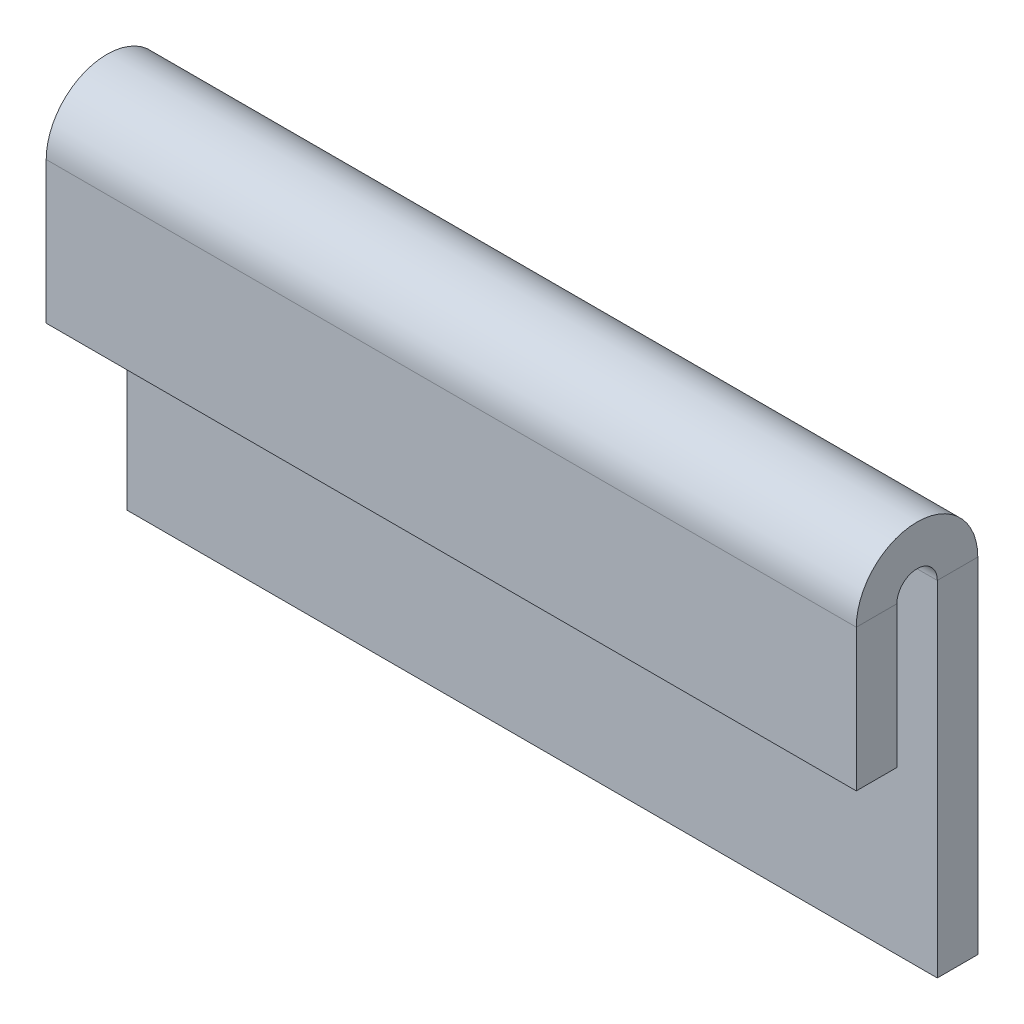
ISO-10303-21;
HEADER;
FILE_DESCRIPTION(('STEP AP214'),'2;1');
FILE_NAME('part.step','',(''),(''),'','','');
FILE_SCHEMA(('AUTOMOTIVE_DESIGN { 1 0 10303 214 1 1 1 1 }'));
ENDSEC;
DATA;
#1=APPLICATION_CONTEXT('core data for automotive mechanical design processes');
#2=APPLICATION_PROTOCOL_DEFINITION('international standard','automotive_design',2000,#1);
#3=PRODUCT_CONTEXT('',#1,'mechanical');
#4=PRODUCT('Part','Part','',(#3));
#5=PRODUCT_RELATED_PRODUCT_CATEGORY('part','',(#4));
#6=PRODUCT_DEFINITION_FORMATION('','',#4);
#7=PRODUCT_DEFINITION_CONTEXT('part definition',#1,'design');
#8=PRODUCT_DEFINITION('design','',#6,#7);
#9=PRODUCT_DEFINITION_SHAPE('','',#8);
#10=(LENGTH_UNIT() NAMED_UNIT(*) SI_UNIT(.MILLI.,.METRE.));
#11=(NAMED_UNIT(*) PLANE_ANGLE_UNIT() SI_UNIT($,.RADIAN.));
#12=(NAMED_UNIT(*) SI_UNIT($,.STERADIAN.) SOLID_ANGLE_UNIT());
#13=UNCERTAINTY_MEASURE_WITH_UNIT(LENGTH_MEASURE(1.E-05),#10,'distance_accuracy_value','');
#14=(GEOMETRIC_REPRESENTATION_CONTEXT(3) GLOBAL_UNCERTAINTY_ASSIGNED_CONTEXT((#13)) GLOBAL_UNIT_ASSIGNED_CONTEXT((#10,
#11,#12)) REPRESENTATION_CONTEXT('',''));
#15=CARTESIAN_POINT('',(0.,0.,0.));
#16=DIRECTION('',(0.,0.,1.));
#17=DIRECTION('',(1.,0.,0.));
#18=AXIS2_PLACEMENT_3D('',#15,#16,#17);
#19=CARTESIAN_POINT('',(0.,0.,-1.));
#20=DIRECTION('',(-1.,0.,0.));
#21=DIRECTION('',(0.,0.,1.));
#22=AXIS2_PLACEMENT_3D('',#19,#20,#21);
#23=PLANE('',#22);
#24=DIRECTION('',(0.,-1.,0.));
#25=VECTOR('',#24,1.);
#26=CARTESIAN_POINT('',(0.,0.,0.));
#27=LINE('',#26,#25);
#28=CARTESIAN_POINT('',(0.,8.5,0.));
#29=VERTEX_POINT('',#28);
#30=CARTESIAN_POINT('',(0.,0.,0.));
#31=VERTEX_POINT('',#30);
#32=EDGE_CURVE('E100',#29,#31,#27,.T.);
#33=ORIENTED_EDGE('',*,*,#32,.F.);
#34=DIRECTION('',(0.,0.,-1.));
#35=VECTOR('',#34,1.);
#36=CARTESIAN_POINT('',(0.,8.5,0.));
#37=LINE('',#36,#35);
#38=CARTESIAN_POINT('',(0.,8.5,-1.));
#39=VERTEX_POINT('',#38);
#40=EDGE_CURVE('E142',#29,#39,#37,.T.);
#41=ORIENTED_EDGE('',*,*,#40,.T.);
#42=DIRECTION('',(0.,-1.,0.));
#43=VECTOR('',#42,1.);
#44=CARTESIAN_POINT('',(0.,0.,-1.));
#45=LINE('',#44,#43);
#46=CARTESIAN_POINT('',(0.,0.,-1.));
#47=VERTEX_POINT('',#46);
#48=EDGE_CURVE('E91',#39,#47,#45,.T.);
#49=ORIENTED_EDGE('',*,*,#48,.T.);
#50=DIRECTION('',(0.,0.,1.));
#51=VECTOR('',#50,1.);
#52=CARTESIAN_POINT('',(0.,0.,-1.));
#53=LINE('',#52,#51);
#54=EDGE_CURVE('E50',#47,#31,#53,.T.);
#55=ORIENTED_EDGE('',*,*,#54,.T.);
#56=EDGE_LOOP('',(#33,#41,#49,#55));
#57=FACE_BOUND('',#56,.T.);
#58=ADVANCED_FACE('F42',(#57),#23,.T.);
#59=CARTESIAN_POINT('',(20.,0.,-1.));
#60=DIRECTION('',(1.,0.,0.));
#61=DIRECTION('',(0.,0.,-1.));
#62=AXIS2_PLACEMENT_3D('',#59,#60,#61);
#63=PLANE('',#62);
#64=DIRECTION('',(0.,0.,-1.));
#65=VECTOR('',#64,1.);
#66=CARTESIAN_POINT('',(20.,8.5,0.));
#67=LINE('',#66,#65);
#68=CARTESIAN_POINT('',(20.,8.5,0.));
#69=VERTEX_POINT('',#68);
#70=CARTESIAN_POINT('',(20.,8.5,-1.));
#71=VERTEX_POINT('',#70);
#72=EDGE_CURVE('E89',#69,#71,#67,.T.);
#73=ORIENTED_EDGE('',*,*,#72,.F.);
#74=DIRECTION('',(0.,1.,0.));
#75=VECTOR('',#74,1.);
#76=CARTESIAN_POINT('',(20.,0.,0.));
#77=LINE('',#76,#75);
#78=CARTESIAN_POINT('',(20.,0.,0.));
#79=VERTEX_POINT('',#78);
#80=EDGE_CURVE('E88',#79,#69,#77,.T.);
#81=ORIENTED_EDGE('',*,*,#80,.F.);
#82=DIRECTION('',(0.,0.,1.));
#83=VECTOR('',#82,1.);
#84=CARTESIAN_POINT('',(20.,0.,-1.));
#85=LINE('',#84,#83);
#86=CARTESIAN_POINT('',(20.,0.,-1.));
#87=VERTEX_POINT('',#86);
#88=EDGE_CURVE('E11',#87,#79,#85,.T.);
#89=ORIENTED_EDGE('',*,*,#88,.F.);
#90=DIRECTION('',(0.,1.,0.));
#91=VECTOR('',#90,1.);
#92=CARTESIAN_POINT('',(20.,0.,-1.));
#93=LINE('',#92,#91);
#94=EDGE_CURVE('E103',#87,#71,#93,.T.);
#95=ORIENTED_EDGE('',*,*,#94,.T.);
#96=EDGE_LOOP('',(#73,#81,#89,#95));
#97=FACE_BOUND('',#96,.T.);
#98=ADVANCED_FACE('F87',(#97),#63,.T.);
#99=CARTESIAN_POINT('',(0.,0.,-1.));
#100=DIRECTION('',(0.,-1.,0.));
#101=DIRECTION('',(0.,0.,-1.));
#102=AXIS2_PLACEMENT_3D('',#99,#100,#101);
#103=PLANE('',#102);
#104=DIRECTION('',(1.,0.,0.));
#105=VECTOR('',#104,1.);
#106=CARTESIAN_POINT('',(0.,0.,0.));
#107=LINE('',#106,#105);
#108=EDGE_CURVE('E81',#31,#79,#107,.T.);
#109=ORIENTED_EDGE('',*,*,#108,.F.);
#110=ORIENTED_EDGE('',*,*,#54,.F.);
#111=DIRECTION('',(1.,0.,0.));
#112=VECTOR('',#111,1.);
#113=CARTESIAN_POINT('',(0.,0.,-1.));
#114=LINE('',#113,#112);
#115=EDGE_CURVE('E84',#47,#87,#114,.T.);
#116=ORIENTED_EDGE('',*,*,#115,.T.);
#117=ORIENTED_EDGE('',*,*,#88,.T.);
#118=EDGE_LOOP('',(#109,#110,#116,#117));
#119=FACE_BOUND('',#118,.T.);
#120=ADVANCED_FACE('F77',(#119),#103,.T.);
#121=CARTESIAN_POINT('',(0.,0.,-1.));
#122=DIRECTION('',(0.,0.,-1.));
#123=DIRECTION('',(-1.,0.,0.));
#124=AXIS2_PLACEMENT_3D('',#121,#122,#123);
#125=PLANE('',#124);
#126=DIRECTION('',(-1.,0.,0.));
#127=VECTOR('',#126,1.);
#128=CARTESIAN_POINT('',(0.,8.5,-1.));
#129=LINE('',#128,#127);
#130=EDGE_CURVE('E156',#39,#71,#129,.F.);
#131=ORIENTED_EDGE('',*,*,#130,.T.);
#132=ORIENTED_EDGE('',*,*,#94,.F.);
#133=ORIENTED_EDGE('',*,*,#115,.F.);
#134=ORIENTED_EDGE('',*,*,#48,.F.);
#135=EDGE_LOOP('',(#131,#132,#133,#134));
#136=FACE_BOUND('',#135,.T.);
#137=ADVANCED_FACE('F163',(#136),#125,.T.);
#138=CARTESIAN_POINT('',(0.,0.,0.));
#139=DIRECTION('',(0.,0.,-1.));
#140=DIRECTION('',(-1.,0.,0.));
#141=AXIS2_PLACEMENT_3D('',#138,#139,#140);
#142=PLANE('',#141);
#143=ORIENTED_EDGE('',*,*,#80,.T.);
#144=DIRECTION('',(-1.,0.,0.));
#145=VECTOR('',#144,1.);
#146=CARTESIAN_POINT('',(0.,8.5,0.));
#147=LINE('',#146,#145);
#148=EDGE_CURVE('E146',#29,#69,#147,.F.);
#149=ORIENTED_EDGE('',*,*,#148,.F.);
#150=ORIENTED_EDGE('',*,*,#32,.T.);
#151=ORIENTED_EDGE('',*,*,#108,.T.);
#152=EDGE_LOOP('',(#143,#149,#150,#151));
#153=FACE_BOUND('',#152,.T.);
#154=ADVANCED_FACE('F92',(#153),#142,.F.);
#155=CARTESIAN_POINT('',(0.,6.75,2.));
#156=DIRECTION('',(1.,0.,0.));
#157=DIRECTION('',(0.,1.,0.));
#158=AXIS2_PLACEMENT_3D('',#155,#156,#157);
#159=PLANE('',#158);
#160=DIRECTION('',(0.,0.,1.));
#161=VECTOR('',#160,1.);
#162=CARTESIAN_POINT('',(0.,8.5,2.));
#163=LINE('',#162,#161);
#164=CARTESIAN_POINT('',(0.,8.5,1.));
#165=VERTEX_POINT('',#164);
#166=CARTESIAN_POINT('',(0.,8.5,2.));
#167=VERTEX_POINT('',#166);
#168=EDGE_CURVE('E111',#165,#167,#163,.T.);
#169=ORIENTED_EDGE('',*,*,#168,.F.);
#170=DIRECTION('',(0.,1.,0.));
#171=VECTOR('',#170,1.);
#172=CARTESIAN_POINT('',(0.,6.75,1.));
#173=LINE('',#172,#171);
#174=CARTESIAN_POINT('',(0.,5.,1.));
#175=VERTEX_POINT('',#174);
#176=EDGE_CURVE('E122',#175,#165,#173,.T.);
#177=ORIENTED_EDGE('',*,*,#176,.F.);
#178=DIRECTION('',(0.,0.,1.));
#179=VECTOR('',#178,1.);
#180=CARTESIAN_POINT('',(0.,5.,2.));
#181=LINE('',#180,#179);
#182=CARTESIAN_POINT('',(0.,5.,2.));
#183=VERTEX_POINT('',#182);
#184=EDGE_CURVE('E109',#175,#183,#181,.T.);
#185=ORIENTED_EDGE('',*,*,#184,.T.);
#186=DIRECTION('',(0.,1.,0.));
#187=VECTOR('',#186,1.);
#188=CARTESIAN_POINT('',(0.,6.75,2.));
#189=LINE('',#188,#187);
#190=EDGE_CURVE('E137',#183,#167,#189,.T.);
#191=ORIENTED_EDGE('',*,*,#190,.T.);
#192=EDGE_LOOP('',(#169,#177,#185,#191));
#193=FACE_BOUND('',#192,.T.);
#194=ADVANCED_FACE('F186',(#193),#159,.F.);
#195=CARTESIAN_POINT('',(10.,5.,2.));
#196=DIRECTION('',(0.,1.,0.));
#197=DIRECTION('',(-1.,0.,0.));
#198=AXIS2_PLACEMENT_3D('',#195,#196,#197);
#199=PLANE('',#198);
#200=ORIENTED_EDGE('',*,*,#184,.F.);
#201=DIRECTION('',(1.,0.,0.));
#202=VECTOR('',#201,1.);
#203=CARTESIAN_POINT('',(10.,5.,1.));
#204=LINE('',#203,#202);
#205=CARTESIAN_POINT('',(20.,5.,1.));
#206=VERTEX_POINT('',#205);
#207=EDGE_CURVE('E126',#206,#175,#204,.F.);
#208=ORIENTED_EDGE('',*,*,#207,.F.);
#209=DIRECTION('',(0.,0.,1.));
#210=VECTOR('',#209,1.);
#211=CARTESIAN_POINT('',(20.,5.,2.));
#212=LINE('',#211,#210);
#213=CARTESIAN_POINT('',(20.,5.,2.));
#214=VERTEX_POINT('',#213);
#215=EDGE_CURVE('E110',#206,#214,#212,.T.);
#216=ORIENTED_EDGE('',*,*,#215,.T.);
#217=DIRECTION('',(-1.,0.,0.));
#218=VECTOR('',#217,1.);
#219=CARTESIAN_POINT('',(10.,5.,2.));
#220=LINE('',#219,#218);
#221=EDGE_CURVE('E112',#214,#183,#220,.T.);
#222=ORIENTED_EDGE('',*,*,#221,.T.);
#223=EDGE_LOOP('',(#200,#208,#216,#222));
#224=FACE_BOUND('',#223,.T.);
#225=ADVANCED_FACE('F198',(#224),#199,.F.);
#226=CARTESIAN_POINT('',(20.,6.75,2.));
#227=DIRECTION('',(-1.,0.,0.));
#228=DIRECTION('',(0.,-1.,0.));
#229=AXIS2_PLACEMENT_3D('',#226,#227,#228);
#230=PLANE('',#229);
#231=DIRECTION('',(0.,1.,0.));
#232=VECTOR('',#231,1.);
#233=CARTESIAN_POINT('',(20.,6.75,1.));
#234=LINE('',#233,#232);
#235=CARTESIAN_POINT('',(20.,8.5,1.));
#236=VERTEX_POINT('',#235);
#237=EDGE_CURVE('E120',#236,#206,#234,.F.);
#238=ORIENTED_EDGE('',*,*,#237,.F.);
#239=DIRECTION('',(0.,0.,1.));
#240=VECTOR('',#239,1.);
#241=CARTESIAN_POINT('',(20.,8.5,2.));
#242=LINE('',#241,#240);
#243=CARTESIAN_POINT('',(20.,8.5,2.));
#244=VERTEX_POINT('',#243);
#245=EDGE_CURVE('E99',#236,#244,#242,.T.);
#246=ORIENTED_EDGE('',*,*,#245,.T.);
#247=DIRECTION('',(0.,-1.,0.));
#248=VECTOR('',#247,1.);
#249=CARTESIAN_POINT('',(20.,6.75,2.));
#250=LINE('',#249,#248);
#251=EDGE_CURVE('E133',#244,#214,#250,.T.);
#252=ORIENTED_EDGE('',*,*,#251,.T.);
#253=ORIENTED_EDGE('',*,*,#215,.F.);
#254=EDGE_LOOP('',(#238,#246,#252,#253));
#255=FACE_BOUND('',#254,.T.);
#256=ADVANCED_FACE('F192',(#255),#230,.F.);
#257=CARTESIAN_POINT('',(10.,6.75,2.));
#258=DIRECTION('',(0.,0.,1.));
#259=DIRECTION('',(1.,0.,0.));
#260=AXIS2_PLACEMENT_3D('',#257,#258,#259);
#261=PLANE('',#260);
#262=ORIENTED_EDGE('',*,*,#221,.F.);
#263=ORIENTED_EDGE('',*,*,#251,.F.);
#264=DIRECTION('',(1.,0.,0.));
#265=VECTOR('',#264,1.);
#266=CARTESIAN_POINT('',(10.,8.5,2.));
#267=LINE('',#266,#265);
#268=EDGE_CURVE('E135',#167,#244,#267,.T.);
#269=ORIENTED_EDGE('',*,*,#268,.F.);
#270=ORIENTED_EDGE('',*,*,#190,.F.);
#271=EDGE_LOOP('',(#262,#263,#269,#270));
#272=FACE_BOUND('',#271,.T.);
#273=ADVANCED_FACE('F195',(#272),#261,.T.);
#274=CARTESIAN_POINT('',(10.,6.75,1.));
#275=DIRECTION('',(0.,0.,1.));
#276=DIRECTION('',(1.,0.,0.));
#277=AXIS2_PLACEMENT_3D('',#274,#275,#276);
#278=PLANE('',#277);
#279=ORIENTED_EDGE('',*,*,#207,.T.);
#280=ORIENTED_EDGE('',*,*,#176,.T.);
#281=DIRECTION('',(1.,0.,0.));
#282=VECTOR('',#281,1.);
#283=CARTESIAN_POINT('',(10.,8.5,1.));
#284=LINE('',#283,#282);
#285=EDGE_CURVE('E125',#165,#236,#284,.T.);
#286=ORIENTED_EDGE('',*,*,#285,.T.);
#287=ORIENTED_EDGE('',*,*,#237,.T.);
#288=EDGE_LOOP('',(#279,#280,#286,#287));
#289=FACE_BOUND('',#288,.T.);
#290=ADVANCED_FACE('F204',(#289),#278,.F.);
#291=CARTESIAN_POINT('',(20.,8.5,0.5));
#292=DIRECTION('',(1.,0.,0.));
#293=DIRECTION('',(0.,0.,-1.));
#294=AXIS2_PLACEMENT_3D('',#291,#292,#293);
#295=PLANE('',#294);
#296=ORIENTED_EDGE('',*,*,#245,.F.);
#297=CARTESIAN_POINT('',(20.,8.5,0.5));
#298=DIRECTION('',(-1.,0.,0.));
#299=DIRECTION('',(0.,0.,1.));
#300=AXIS2_PLACEMENT_3D('',#297,#298,#299);
#301=CIRCLE('',#300,0.5);
#302=EDGE_CURVE('E147',#69,#236,#301,.F.);
#303=ORIENTED_EDGE('',*,*,#302,.F.);
#304=ORIENTED_EDGE('',*,*,#72,.T.);
#305=CARTESIAN_POINT('',(20.,8.5,0.5));
#306=DIRECTION('',(-1.,0.,0.));
#307=DIRECTION('',(0.,0.,1.));
#308=AXIS2_PLACEMENT_3D('',#305,#306,#307);
#309=CIRCLE('',#308,1.5);
#310=EDGE_CURVE('E144',#71,#244,#309,.F.);
#311=ORIENTED_EDGE('',*,*,#310,.T.);
#312=EDGE_LOOP('',(#296,#303,#304,#311));
#313=FACE_BOUND('',#312,.T.);
#314=ADVANCED_FACE('F210',(#313),#295,.T.);
#315=CARTESIAN_POINT('',(0.,8.5,0.5));
#316=DIRECTION('',(1.,0.,0.));
#317=DIRECTION('',(0.,0.,-1.));
#318=AXIS2_PLACEMENT_3D('',#315,#316,#317);
#319=PLANE('',#318);
#320=CARTESIAN_POINT('',(0.,8.5,0.5));
#321=DIRECTION('',(-1.,0.,0.));
#322=DIRECTION('',(0.,0.,1.));
#323=AXIS2_PLACEMENT_3D('',#320,#321,#322);
#324=CIRCLE('',#323,0.5);
#325=EDGE_CURVE('E59',#165,#29,#324,.T.);
#326=ORIENTED_EDGE('',*,*,#325,.F.);
#327=ORIENTED_EDGE('',*,*,#168,.T.);
#328=CARTESIAN_POINT('',(0.,8.5,0.5));
#329=DIRECTION('',(-1.,0.,0.));
#330=DIRECTION('',(0.,0.,1.));
#331=AXIS2_PLACEMENT_3D('',#328,#329,#330);
#332=CIRCLE('',#331,1.5);
#333=EDGE_CURVE('E153',#167,#39,#332,.T.);
#334=ORIENTED_EDGE('',*,*,#333,.T.);
#335=ORIENTED_EDGE('',*,*,#40,.F.);
#336=EDGE_LOOP('',(#326,#327,#334,#335));
#337=FACE_BOUND('',#336,.T.);
#338=ADVANCED_FACE('F171',(#337),#319,.F.);
#339=CARTESIAN_POINT('',(0.,8.5,0.5));
#340=DIRECTION('',(-1.,0.,0.));
#341=DIRECTION('',(0.,0.,1.));
#342=AXIS2_PLACEMENT_3D('',#339,#340,#341);
#343=CYLINDRICAL_SURFACE('',#342,1.5);
#344=ORIENTED_EDGE('',*,*,#130,.F.);
#345=ORIENTED_EDGE('',*,*,#333,.F.);
#346=ORIENTED_EDGE('',*,*,#268,.T.);
#347=ORIENTED_EDGE('',*,*,#310,.F.);
#348=EDGE_LOOP('',(#344,#345,#346,#347));
#349=FACE_BOUND('',#348,.T.);
#350=ADVANCED_FACE('F173',(#349),#343,.T.);
#351=CARTESIAN_POINT('',(0.,8.5,0.5));
#352=DIRECTION('',(-1.,0.,0.));
#353=DIRECTION('',(0.,0.,1.));
#354=AXIS2_PLACEMENT_3D('',#351,#352,#353);
#355=CYLINDRICAL_SURFACE('',#354,0.5);
#356=ORIENTED_EDGE('',*,*,#148,.T.);
#357=ORIENTED_EDGE('',*,*,#302,.T.);
#358=ORIENTED_EDGE('',*,*,#285,.F.);
#359=ORIENTED_EDGE('',*,*,#325,.T.);
#360=EDGE_LOOP('',(#356,#357,#358,#359));
#361=FACE_BOUND('',#360,.T.);
#362=ADVANCED_FACE('F220',(#361),#355,.F.);
#363=CLOSED_SHELL('',(#58,#98,#120,#137,#154,#194,#225,#256,#273,#290,#314,#338,#350,#362));
#364=MANIFOLD_SOLID_BREP('B2',#363);
#365=ADVANCED_BREP_SHAPE_REPRESENTATION('',(#18,#364),#14);
#366=SHAPE_DEFINITION_REPRESENTATION(#9,#365);
ENDSEC;
END-ISO-10303-21;
